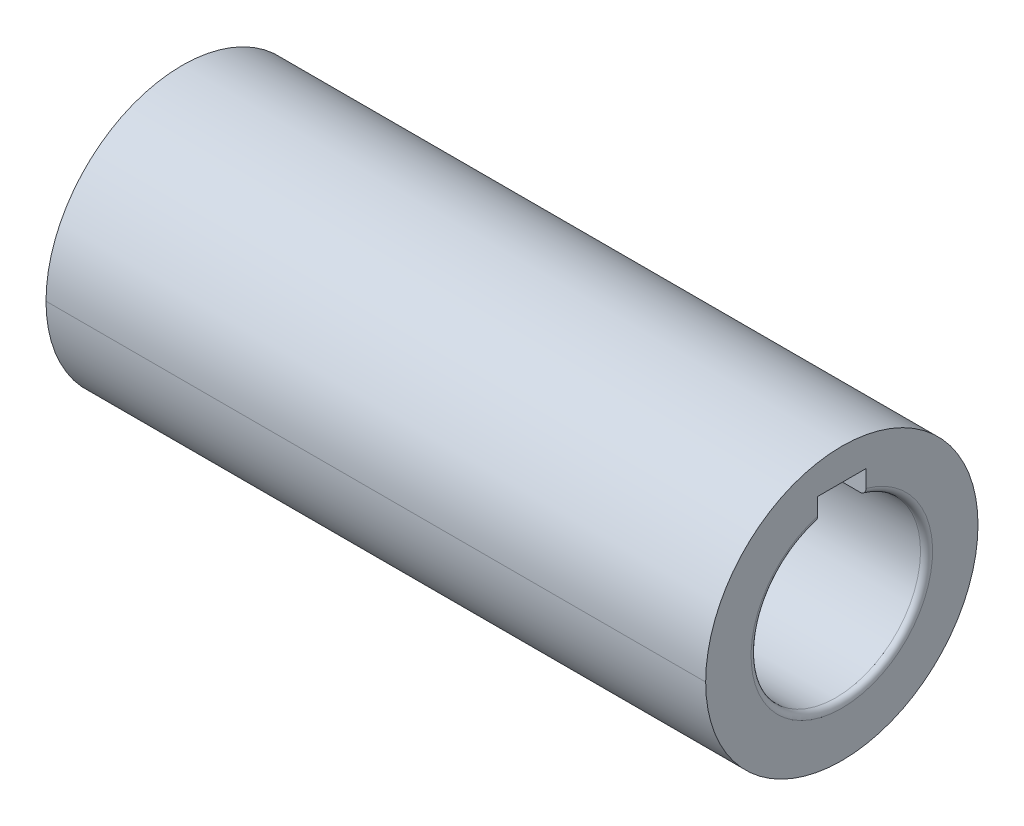
ISO-10303-21;
HEADER;
FILE_DESCRIPTION(('STEP AP214'),'2;1');
FILE_NAME('part.step','',(''),(''),'','','');
FILE_SCHEMA(('AUTOMOTIVE_DESIGN { 1 0 10303 214 1 1 1 1 }'));
ENDSEC;
DATA;
#1=APPLICATION_CONTEXT('core data for automotive mechanical design processes');
#2=APPLICATION_PROTOCOL_DEFINITION('international standard','automotive_design',2000,#1);
#3=PRODUCT_CONTEXT('',#1,'mechanical');
#4=PRODUCT('Part','Part','',(#3));
#5=PRODUCT_RELATED_PRODUCT_CATEGORY('part','',(#4));
#6=PRODUCT_DEFINITION_FORMATION('','',#4);
#7=PRODUCT_DEFINITION_CONTEXT('part definition',#1,'design');
#8=PRODUCT_DEFINITION('design','',#6,#7);
#9=PRODUCT_DEFINITION_SHAPE('','',#8);
#10=(LENGTH_UNIT() NAMED_UNIT(*) SI_UNIT(.MILLI.,.METRE.));
#11=(NAMED_UNIT(*) PLANE_ANGLE_UNIT() SI_UNIT($,.RADIAN.));
#12=(NAMED_UNIT(*) SI_UNIT($,.STERADIAN.) SOLID_ANGLE_UNIT());
#13=UNCERTAINTY_MEASURE_WITH_UNIT(LENGTH_MEASURE(1.E-05),#10,'distance_accuracy_value','');
#14=(GEOMETRIC_REPRESENTATION_CONTEXT(3) GLOBAL_UNCERTAINTY_ASSIGNED_CONTEXT((#13)) GLOBAL_UNIT_ASSIGNED_CONTEXT((#10,
#11,#12)) REPRESENTATION_CONTEXT('',''));
#15=CARTESIAN_POINT('',(0.,0.,0.));
#16=DIRECTION('',(0.,0.,1.));
#17=DIRECTION('',(1.,0.,0.));
#18=AXIS2_PLACEMENT_3D('',#15,#16,#17);
#19=CARTESIAN_POINT('',(0.,0.,0.));
#20=DIRECTION('',(1.,0.,0.));
#21=DIRECTION('',(0.,0.,-1.));
#22=AXIS2_PLACEMENT_3D('',#19,#20,#21);
#23=PLANE('',#22);
#24=CARTESIAN_POINT('',(0.,0.,0.));
#25=DIRECTION('',(1.,0.,0.));
#26=DIRECTION('',(0.,0.,-1.));
#27=AXIS2_PLACEMENT_3D('',#24,#25,#26);
#28=CIRCLE('',#27,22.5);
#29=CARTESIAN_POINT('',(0.,0.,22.5));
#30=VERTEX_POINT('',#29);
#31=CARTESIAN_POINT('',(0.,0.,-22.5));
#32=VERTEX_POINT('',#31);
#33=EDGE_CURVE('E11',#30,#32,#28,.T.);
#34=ORIENTED_EDGE('',*,*,#33,.F.);
#35=CARTESIAN_POINT('',(0.,0.,0.));
#36=DIRECTION('',(1.,0.,0.));
#37=DIRECTION('',(0.,0.,-1.));
#38=AXIS2_PLACEMENT_3D('',#35,#36,#37);
#39=CIRCLE('',#38,22.5);
#40=EDGE_CURVE('E25',#32,#30,#39,.T.);
#41=ORIENTED_EDGE('',*,*,#40,.F.);
#42=EDGE_LOOP('',(#34,#41));
#43=FACE_BOUND('',#42,.T.);
#44=ADVANCED_FACE('F17',(#43),#23,.F.);
#45=CARTESIAN_POINT('',(109.,0.,0.));
#46=DIRECTION('',(1.,0.,0.));
#47=DIRECTION('',(0.,-1.,0.));
#48=AXIS2_PLACEMENT_3D('',#45,#46,#47);
#49=CYLINDRICAL_SURFACE('',#48,22.5);
#50=DIRECTION('',(1.,0.,0.));
#51=VECTOR('',#50,1.);
#52=CARTESIAN_POINT('',(0.,0.,22.5));
#53=LINE('',#52,#51);
#54=CARTESIAN_POINT('',(109.,0.,22.5));
#55=VERTEX_POINT('',#54);
#56=EDGE_CURVE('E194',#30,#55,#53,.T.);
#57=ORIENTED_EDGE('',*,*,#56,.T.);
#58=CARTESIAN_POINT('',(109.,0.,0.));
#59=DIRECTION('',(1.,0.,0.));
#60=DIRECTION('',(0.,0.,-1.));
#61=AXIS2_PLACEMENT_3D('',#58,#59,#60);
#62=CIRCLE('',#61,22.5);
#63=CARTESIAN_POINT('',(109.,0.,-22.5));
#64=VERTEX_POINT('',#63);
#65=EDGE_CURVE('E197',#64,#55,#62,.T.);
#66=ORIENTED_EDGE('',*,*,#65,.F.);
#67=DIRECTION('',(1.,0.,0.));
#68=VECTOR('',#67,1.);
#69=CARTESIAN_POINT('',(0.,0.,-22.5));
#70=LINE('',#69,#68);
#71=EDGE_CURVE('E202',#32,#64,#70,.T.);
#72=ORIENTED_EDGE('',*,*,#71,.F.);
#73=ORIENTED_EDGE('',*,*,#40,.T.);
#74=EDGE_LOOP('',(#57,#66,#72,#73));
#75=FACE_BOUND('',#74,.T.);
#76=ADVANCED_FACE('F186',(#75),#49,.T.);
#77=CARTESIAN_POINT('',(109.,0.,0.));
#78=DIRECTION('',(1.,0.,0.));
#79=DIRECTION('',(0.,1.,0.));
#80=AXIS2_PLACEMENT_3D('',#77,#78,#79);
#81=CYLINDRICAL_SURFACE('',#80,22.5);
#82=ORIENTED_EDGE('',*,*,#56,.F.);
#83=ORIENTED_EDGE('',*,*,#33,.T.);
#84=ORIENTED_EDGE('',*,*,#71,.T.);
#85=CARTESIAN_POINT('',(109.,0.,0.));
#86=DIRECTION('',(1.,0.,0.));
#87=DIRECTION('',(0.,0.,-1.));
#88=AXIS2_PLACEMENT_3D('',#85,#86,#87);
#89=CIRCLE('',#88,22.5);
#90=EDGE_CURVE('E201',#55,#64,#89,.T.);
#91=ORIENTED_EDGE('',*,*,#90,.F.);
#92=EDGE_LOOP('',(#82,#83,#84,#91));
#93=FACE_BOUND('',#92,.T.);
#94=ADVANCED_FACE('F183',(#93),#81,.T.);
#95=CARTESIAN_POINT('',(109.,22.5,0.));
#96=DIRECTION('',(-1.,0.,0.));
#97=DIRECTION('',(0.,0.,1.));
#98=AXIS2_PLACEMENT_3D('',#95,#96,#97);
#99=PLANE('',#98);
#100=DIRECTION('',(0.,0.,1.));
#101=VECTOR('',#100,1.);
#102=CARTESIAN_POINT('',(109.,17.3,-4.));
#103=LINE('',#102,#101);
#104=CARTESIAN_POINT('',(109.,17.3,-4.));
#105=VERTEX_POINT('',#104);
#106=CARTESIAN_POINT('',(109.,17.3,4.));
#107=VERTEX_POINT('',#106);
#108=EDGE_CURVE('E204',#105,#107,#103,.T.);
#109=ORIENTED_EDGE('',*,*,#108,.F.);
#110=DIRECTION('',(0.,1.,0.));
#111=VECTOR('',#110,1.);
#112=CARTESIAN_POINT('',(109.,3.3,-4.));
#113=LINE('',#112,#111);
#114=CARTESIAN_POINT('',(109.,14.456832294794,-4.));
#115=VERTEX_POINT('',#114);
#116=EDGE_CURVE('E224',#115,#105,#113,.T.);
#117=ORIENTED_EDGE('',*,*,#116,.F.);
#118=CARTESIAN_POINT('',(109.,0.,0.));
#119=DIRECTION('',(1.,0.,0.));
#120=DIRECTION('',(0.,0.,-1.));
#121=AXIS2_PLACEMENT_3D('',#118,#119,#120);
#122=CIRCLE('',#121,15.);
#123=CARTESIAN_POINT('',(109.,14.456832294794,4.));
#124=VERTEX_POINT('',#123);
#125=EDGE_CURVE('E97',#124,#115,#122,.T.);
#126=ORIENTED_EDGE('',*,*,#125,.F.);
#127=DIRECTION('',(0.,-1.,0.));
#128=VECTOR('',#127,1.);
#129=CARTESIAN_POINT('',(109.,17.3,4.));
#130=LINE('',#129,#128);
#131=EDGE_CURVE('E231',#107,#124,#130,.T.);
#132=ORIENTED_EDGE('',*,*,#131,.F.);
#133=EDGE_LOOP('',(#109,#117,#126,#132));
#134=FACE_BOUND('',#133,.T.);
#135=ORIENTED_EDGE('',*,*,#65,.T.);
#136=ORIENTED_EDGE('',*,*,#90,.T.);
#137=EDGE_LOOP('',(#135,#136));
#138=FACE_BOUND('',#137,.T.);
#139=ADVANCED_FACE('F179',(#134,#138),#99,.F.);
#140=CARTESIAN_POINT('',(50.,17.3,4.));
#141=DIRECTION('',(0.,0.,1.));
#142=DIRECTION('',(1.,0.,0.));
#143=AXIS2_PLACEMENT_3D('',#140,#141,#142);
#144=PLANE('',#143);
#145=CARTESIAN_POINT('',(109.,14.456832294794,4.));
#146=CARTESIAN_POINT('',(109.,14.4182104959364,4.));
#147=CARTESIAN_POINT('',(108.997864294437,14.3788160183246,4.));
#148=CARTESIAN_POINT('',(108.980695211563,14.2209044349443,4.));
#149=CARTESIAN_POINT('',(108.946972976616,14.1019350800131,4.));
#150=CARTESIAN_POINT('',(108.843215114544,13.8853823409528,4.));
#151=CARTESIAN_POINT('',(108.771726232779,13.7846609882015,4.));
#152=CARTESIAN_POINT('',(108.60299754638,13.6188446885519,4.));
#153=CARTESIAN_POINT('',(108.504018592894,13.5505239205219,4.));
#154=CARTESIAN_POINT('',(108.332693728862,13.4730689459408,4.));
#155=CARTESIAN_POINT('',(108.264019920388,13.4506895764725,4.));
#156=CARTESIAN_POINT('',(108.130574595759,13.4231351595388,4.));
#157=CARTESIAN_POINT('',(108.064902315498,13.4164078649983,4.));
#158=CARTESIAN_POINT('',(108.,13.4164078649987,4.));
#159=B_SPLINE_CURVE_WITH_KNOTS('',3,(#145,#146,#147,#148,#149,#150,#151,#152,#153,#154,#155,
#156,#157,#158),.UNSPECIFIED.,.F.,.F.,(4,2,2,2,2,2,4),(0.,0.0726423430978282,0.298760549149237,
0.524287765753332,0.743712719939138,0.877927584688607,1.),.UNSPECIFIED.);
#160=CARTESIAN_POINT('',(108.,13.4164078649987,4.));
#161=VERTEX_POINT('',#160);
#162=EDGE_CURVE('E161',#124,#161,#159,.T.);
#163=ORIENTED_EDGE('',*,*,#162,.T.);
#164=DIRECTION('',(1.,0.,0.));
#165=VECTOR('',#164,1.);
#166=CARTESIAN_POINT('',(109.,13.4164078649987,4.));
#167=LINE('',#166,#165);
#168=CARTESIAN_POINT('',(50.,13.4164078649987,4.));
#169=VERTEX_POINT('',#168);
#170=EDGE_CURVE('E91',#169,#161,#167,.T.);
#171=ORIENTED_EDGE('',*,*,#170,.F.);
#172=DIRECTION('',(0.,-1.,0.));
#173=VECTOR('',#172,1.);
#174=CARTESIAN_POINT('',(50.,17.3,4.));
#175=LINE('',#174,#173);
#176=CARTESIAN_POINT('',(50.,17.3,4.));
#177=VERTEX_POINT('',#176);
#178=EDGE_CURVE('E153',#177,#169,#175,.T.);
#179=ORIENTED_EDGE('',*,*,#178,.F.);
#180=DIRECTION('',(1.,0.,0.));
#181=VECTOR('',#180,1.);
#182=CARTESIAN_POINT('',(50.,17.3,4.));
#183=LINE('',#182,#181);
#184=EDGE_CURVE('E148',#177,#107,#183,.T.);
#185=ORIENTED_EDGE('',*,*,#184,.T.);
#186=ORIENTED_EDGE('',*,*,#131,.T.);
#187=EDGE_LOOP('',(#163,#171,#179,#185,#186));
#188=FACE_BOUND('',#187,.T.);
#189=ADVANCED_FACE('F169',(#188),#144,.F.);
#190=CARTESIAN_POINT('',(50.,17.3,-4.));
#191=DIRECTION('',(0.,1.,0.));
#192=DIRECTION('',(0.,0.,1.));
#193=AXIS2_PLACEMENT_3D('',#190,#191,#192);
#194=PLANE('',#193);
#195=DIRECTION('',(1.,0.,0.));
#196=VECTOR('',#195,1.);
#197=CARTESIAN_POINT('',(50.,17.3,-4.));
#198=LINE('',#197,#196);
#199=CARTESIAN_POINT('',(50.,17.3,-4.));
#200=VERTEX_POINT('',#199);
#201=EDGE_CURVE('E143',#200,#105,#198,.T.);
#202=ORIENTED_EDGE('',*,*,#201,.T.);
#203=ORIENTED_EDGE('',*,*,#108,.T.);
#204=ORIENTED_EDGE('',*,*,#184,.F.);
#205=DIRECTION('',(0.,0.,1.));
#206=VECTOR('',#205,1.);
#207=CARTESIAN_POINT('',(50.,17.3,-4.));
#208=LINE('',#207,#206);
#209=EDGE_CURVE('E138',#200,#177,#208,.T.);
#210=ORIENTED_EDGE('',*,*,#209,.F.);
#211=EDGE_LOOP('',(#202,#203,#204,#210));
#212=FACE_BOUND('',#211,.T.);
#213=ADVANCED_FACE('F178',(#212),#194,.F.);
#214=CARTESIAN_POINT('',(50.,14.,0.));
#215=DIRECTION('',(-1.,0.,0.));
#216=DIRECTION('',(0.,0.,1.));
#217=AXIS2_PLACEMENT_3D('',#214,#215,#216);
#218=PLANE('',#217);
#219=ORIENTED_EDGE('',*,*,#178,.T.);
#220=CARTESIAN_POINT('',(50.,0.,0.));
#221=DIRECTION('',(1.,0.,0.));
#222=DIRECTION('',(0.,0.,-1.));
#223=AXIS2_PLACEMENT_3D('',#220,#221,#222);
#224=CIRCLE('',#223,14.);
#225=CARTESIAN_POINT('',(50.,13.4164078649987,-4.));
#226=VERTEX_POINT('',#225);
#227=EDGE_CURVE('E134',#169,#226,#224,.T.);
#228=ORIENTED_EDGE('',*,*,#227,.T.);
#229=DIRECTION('',(0.,1.,0.));
#230=VECTOR('',#229,1.);
#231=CARTESIAN_POINT('',(50.,3.3,-4.));
#232=LINE('',#231,#230);
#233=EDGE_CURVE('E83',#226,#200,#232,.T.);
#234=ORIENTED_EDGE('',*,*,#233,.T.);
#235=ORIENTED_EDGE('',*,*,#209,.T.);
#236=EDGE_LOOP('',(#219,#228,#234,#235));
#237=FACE_BOUND('',#236,.T.);
#238=ADVANCED_FACE('F120',(#237),#218,.F.);
#239=CARTESIAN_POINT('',(50.,3.3,-4.));
#240=DIRECTION('',(0.,0.,-1.));
#241=DIRECTION('',(-1.,0.,0.));
#242=AXIS2_PLACEMENT_3D('',#239,#240,#241);
#243=PLANE('',#242);
#244=CARTESIAN_POINT('',(108.,13.4164078649987,-4.));
#245=CARTESIAN_POINT('',(108.002119772172,13.4164078649987,-4.));
#246=CARTESIAN_POINT('',(108.004333300083,13.4164153177289,-4.));
#247=CARTESIAN_POINT('',(108.069360835707,13.4168532040281,-4.));
#248=CARTESIAN_POINT('',(108.132526497239,13.423538197317,-4.));
#249=CARTESIAN_POINT('',(108.302180496834,13.4585691513973,-4.));
#250=CARTESIAN_POINT('',(108.407749652076,13.5003014859515,-4.));
#251=CARTESIAN_POINT('',(108.596407542798,13.6145104956313,-4.));
#252=CARTESIAN_POINT('',(108.682110880707,13.6884219860957,-4.));
#253=CARTESIAN_POINT('',(108.825696059915,13.8595019938339,-4.));
#254=CARTESIAN_POINT('',(108.884736009644,13.9594844081803,-4.));
#255=CARTESIAN_POINT('',(108.968903940828,14.1741720235175,-4.));
#256=CARTESIAN_POINT('',(108.993805973789,14.292217565201,-4.));
#257=CARTESIAN_POINT('',(108.999646333588,14.425138833948,-4.));
#258=CARTESIAN_POINT('',(109.,14.4412410760645,-4.));
#259=CARTESIAN_POINT('',(109.,14.456832294794,-4.));
#260=B_SPLINE_CURVE_WITH_KNOTS('',3,(#244,#245,#246,#247,#248,#249,#250,#251,#252,#253,#254,
#255,#256,#257,#258,#259),.UNSPECIFIED.,.F.,.F.,(4,2,2,2,2,2,2,4),(0.,0.00398639337591046,
0.122292016979831,0.329764137563787,0.537024114200001,0.749790230795065,0.970679523071879,1.),.UNSPECIFIED.);
#261=CARTESIAN_POINT('',(108.,13.4164078649987,-4.));
#262=VERTEX_POINT('',#261);
#263=EDGE_CURVE('E78',#262,#115,#260,.T.);
#264=ORIENTED_EDGE('',*,*,#263,.T.);
#265=ORIENTED_EDGE('',*,*,#116,.T.);
#266=ORIENTED_EDGE('',*,*,#201,.F.);
#267=ORIENTED_EDGE('',*,*,#233,.F.);
#268=DIRECTION('',(-1.,0.,0.));
#269=VECTOR('',#268,1.);
#270=CARTESIAN_POINT('',(109.,13.4164078649987,-4.));
#271=LINE('',#270,#269);
#272=EDGE_CURVE('E73',#262,#226,#271,.T.);
#273=ORIENTED_EDGE('',*,*,#272,.F.);
#274=EDGE_LOOP('',(#264,#265,#266,#267,#273));
#275=FACE_BOUND('',#274,.T.);
#276=ADVANCED_FACE('F75',(#275),#243,.F.);
#277=CARTESIAN_POINT('',(109.,0.,0.));
#278=DIRECTION('',(1.,0.,0.));
#279=DIRECTION('',(0.,1.,0.));
#280=AXIS2_PLACEMENT_3D('',#277,#278,#279);
#281=CYLINDRICAL_SURFACE('',#280,14.);
#282=ORIENTED_EDGE('',*,*,#227,.F.);
#283=ORIENTED_EDGE('',*,*,#170,.T.);
#284=CARTESIAN_POINT('',(108.,0.,0.));
#285=DIRECTION('',(1.,0.,0.));
#286=DIRECTION('',(0.,0.,-1.));
#287=AXIS2_PLACEMENT_3D('',#284,#285,#286);
#288=CIRCLE('',#287,14.);
#289=EDGE_CURVE('E86',#161,#262,#288,.T.);
#290=ORIENTED_EDGE('',*,*,#289,.T.);
#291=ORIENTED_EDGE('',*,*,#272,.T.);
#292=EDGE_LOOP('',(#282,#283,#290,#291));
#293=FACE_BOUND('',#292,.T.);
#294=ADVANCED_FACE('F90',(#293),#281,.F.);
#295=CARTESIAN_POINT('',(108.000000000007,0.,0.));
#296=DIRECTION('',(1.,0.,0.));
#297=DIRECTION('',(0.,1.,0.));
#298=AXIS2_PLACEMENT_3D('',#295,#296,#297);
#299=TOROIDAL_SURFACE('',#298,14.9999999999933,0.999999999993312);
#300=ORIENTED_EDGE('',*,*,#162,.F.);
#301=ORIENTED_EDGE('',*,*,#125,.T.);
#302=ORIENTED_EDGE('',*,*,#263,.F.);
#303=ORIENTED_EDGE('',*,*,#289,.F.);
#304=EDGE_LOOP('',(#300,#301,#302,#303));
#305=FACE_BOUND('',#304,.T.);
#306=ADVANCED_FACE('F96',(#305),#299,.T.);
#307=CLOSED_SHELL('',(#44,#76,#94,#139,#189,#213,#238,#276,#294,#306));
#308=MANIFOLD_SOLID_BREP('B1',#307);
#309=ADVANCED_BREP_SHAPE_REPRESENTATION('',(#18,#308),#14);
#310=SHAPE_DEFINITION_REPRESENTATION(#9,#309);
ENDSEC;
END-ISO-10303-21;
